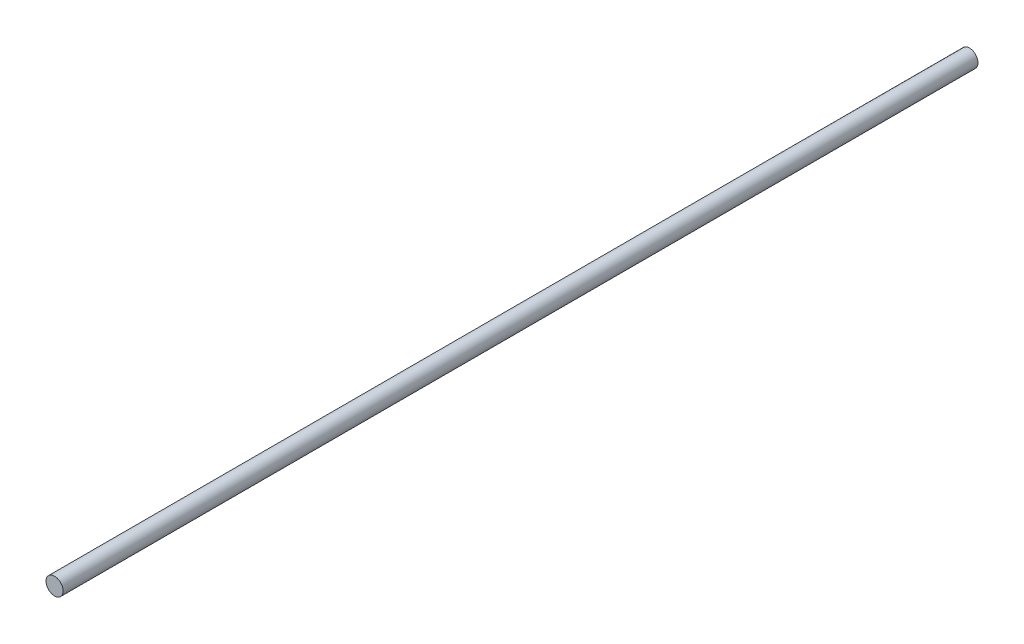
ISO-10303-21;
HEADER;
FILE_DESCRIPTION(('STEP AP214'),'2;1');
FILE_NAME('part.step','',(''),(''),'','','');
FILE_SCHEMA(('AUTOMOTIVE_DESIGN { 1 0 10303 214 1 1 1 1 }'));
ENDSEC;
DATA;
#1=APPLICATION_CONTEXT('core data for automotive mechanical design processes');
#2=APPLICATION_PROTOCOL_DEFINITION('international standard','automotive_design',2000,#1);
#3=PRODUCT_CONTEXT('',#1,'mechanical');
#4=PRODUCT('Part','Part','',(#3));
#5=PRODUCT_RELATED_PRODUCT_CATEGORY('part','',(#4));
#6=PRODUCT_DEFINITION_FORMATION('','',#4);
#7=PRODUCT_DEFINITION_CONTEXT('part definition',#1,'design');
#8=PRODUCT_DEFINITION('design','',#6,#7);
#9=PRODUCT_DEFINITION_SHAPE('','',#8);
#10=(LENGTH_UNIT() NAMED_UNIT(*) SI_UNIT(.MILLI.,.METRE.));
#11=(NAMED_UNIT(*) PLANE_ANGLE_UNIT() SI_UNIT($,.RADIAN.));
#12=(NAMED_UNIT(*) SI_UNIT($,.STERADIAN.) SOLID_ANGLE_UNIT());
#13=UNCERTAINTY_MEASURE_WITH_UNIT(LENGTH_MEASURE(1.E-05),#10,'distance_accuracy_value','');
#14=(GEOMETRIC_REPRESENTATION_CONTEXT(3) GLOBAL_UNCERTAINTY_ASSIGNED_CONTEXT((#13)) GLOBAL_UNIT_ASSIGNED_CONTEXT((#10,
#11,#12)) REPRESENTATION_CONTEXT('',''));
#15=CARTESIAN_POINT('',(0.,0.,0.));
#16=DIRECTION('',(0.,0.,1.));
#17=DIRECTION('',(1.,0.,0.));
#18=AXIS2_PLACEMENT_3D('',#15,#16,#17);
#19=CARTESIAN_POINT('',(0.,0.,160.));
#20=DIRECTION('',(0.,0.,-1.));
#21=DIRECTION('',(-1.,0.,0.));
#22=AXIS2_PLACEMENT_3D('',#19,#20,#21);
#23=CYLINDRICAL_SURFACE('',#22,1.5);
#24=CARTESIAN_POINT('',(0.,0.,160.));
#25=DIRECTION('',(0.,0.,1.));
#26=DIRECTION('',(1.,0.,0.));
#27=AXIS2_PLACEMENT_3D('',#24,#25,#26);
#28=CIRCLE('',#27,1.5);
#29=CARTESIAN_POINT('',(1.5,0.,160.));
#30=VERTEX_POINT('',#29);
#31=EDGE_CURVE('E10',#30,#30,#28,.T.);
#32=ORIENTED_EDGE('',*,*,#31,.F.);
#33=EDGE_LOOP('',(#32));
#34=FACE_BOUND('',#33,.T.);
#35=CARTESIAN_POINT('',(0.,0.,0.));
#36=DIRECTION('',(0.,0.,1.));
#37=DIRECTION('',(1.,0.,0.));
#38=AXIS2_PLACEMENT_3D('',#35,#36,#37);
#39=CIRCLE('',#38,1.5);
#40=CARTESIAN_POINT('',(1.5,0.,0.));
#41=VERTEX_POINT('',#40);
#42=EDGE_CURVE('E44',#41,#41,#39,.T.);
#43=ORIENTED_EDGE('',*,*,#42,.T.);
#44=EDGE_LOOP('',(#43));
#45=FACE_BOUND('',#44,.T.);
#46=ADVANCED_FACE('F41',(#34,#45),#23,.T.);
#47=CARTESIAN_POINT('',(0.,0.,160.));
#48=DIRECTION('',(0.,0.,1.));
#49=DIRECTION('',(1.,0.,0.));
#50=AXIS2_PLACEMENT_3D('',#47,#48,#49);
#51=PLANE('',#50);
#52=ORIENTED_EDGE('',*,*,#31,.T.);
#53=EDGE_LOOP('',(#52));
#54=FACE_BOUND('',#53,.T.);
#55=ADVANCED_FACE('F58',(#54),#51,.T.);
#56=CARTESIAN_POINT('',(0.,0.,0.));
#57=DIRECTION('',(0.,0.,1.));
#58=DIRECTION('',(1.,0.,0.));
#59=AXIS2_PLACEMENT_3D('',#56,#57,#58);
#60=PLANE('',#59);
#61=ORIENTED_EDGE('',*,*,#42,.F.);
#62=EDGE_LOOP('',(#61));
#63=FACE_BOUND('',#62,.T.);
#64=ADVANCED_FACE('F56',(#63),#60,.F.);
#65=CLOSED_SHELL('',(#46,#55,#64));
#66=MANIFOLD_SOLID_BREP('B2',#65);
#67=ADVANCED_BREP_SHAPE_REPRESENTATION('',(#18,#66),#14);
#68=SHAPE_DEFINITION_REPRESENTATION(#9,#67);
ENDSEC;
END-ISO-10303-21;
